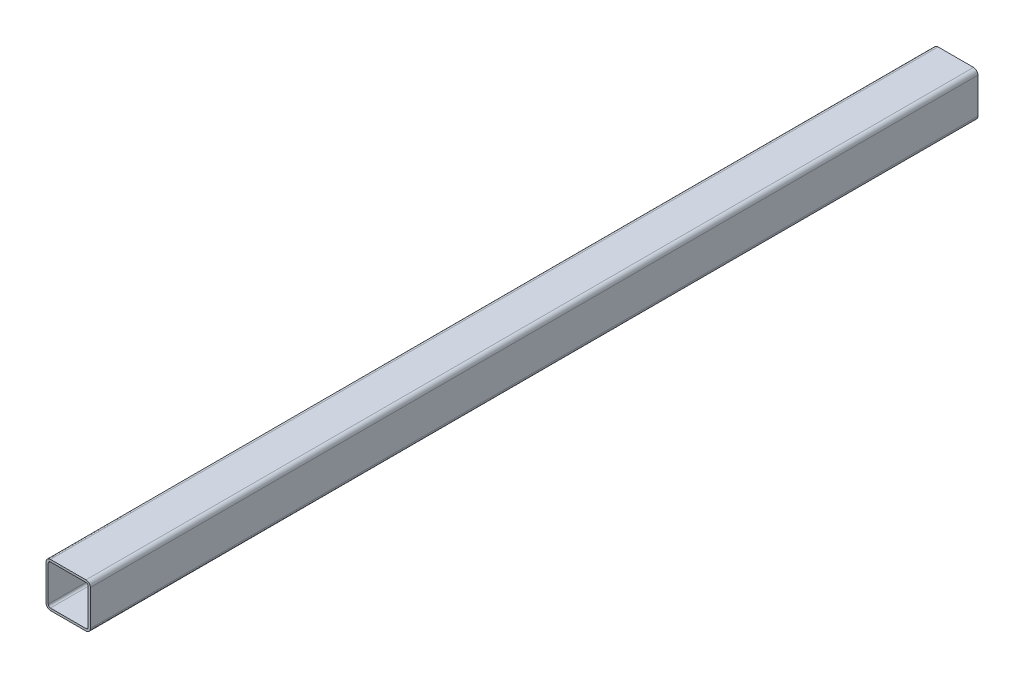
ISO-10303-21;
HEADER;
FILE_DESCRIPTION(('STEP AP214'),'2;1');
FILE_NAME('part.step','',(''),(''),'','','');
FILE_SCHEMA(('AUTOMOTIVE_DESIGN { 1 0 10303 214 1 1 1 1 }'));
ENDSEC;
DATA;
#1=APPLICATION_CONTEXT('core data for automotive mechanical design processes');
#2=APPLICATION_PROTOCOL_DEFINITION('international standard','automotive_design',2000,#1);
#3=PRODUCT_CONTEXT('',#1,'mechanical');
#4=PRODUCT('Part','Part','',(#3));
#5=PRODUCT_RELATED_PRODUCT_CATEGORY('part','',(#4));
#6=PRODUCT_DEFINITION_FORMATION('','',#4);
#7=PRODUCT_DEFINITION_CONTEXT('part definition',#1,'design');
#8=PRODUCT_DEFINITION('design','',#6,#7);
#9=PRODUCT_DEFINITION_SHAPE('','',#8);
#10=(LENGTH_UNIT() NAMED_UNIT(*) SI_UNIT(.MILLI.,.METRE.));
#11=(NAMED_UNIT(*) PLANE_ANGLE_UNIT() SI_UNIT($,.RADIAN.));
#12=(NAMED_UNIT(*) SI_UNIT($,.STERADIAN.) SOLID_ANGLE_UNIT());
#13=UNCERTAINTY_MEASURE_WITH_UNIT(LENGTH_MEASURE(1.E-05),#10,'distance_accuracy_value','');
#14=(GEOMETRIC_REPRESENTATION_CONTEXT(3) GLOBAL_UNCERTAINTY_ASSIGNED_CONTEXT((#13)) GLOBAL_UNIT_ASSIGNED_CONTEXT((#10,
#11,#12)) REPRESENTATION_CONTEXT('',''));
#15=CARTESIAN_POINT('',(0.,0.,0.));
#16=DIRECTION('',(0.,0.,1.));
#17=DIRECTION('',(1.,0.,0.));
#18=AXIS2_PLACEMENT_3D('',#15,#16,#17);
#19=CARTESIAN_POINT('',(-40.,-40.,2000.));
#20=DIRECTION('',(0.,0.,-1.));
#21=DIRECTION('',(-1.,0.,0.));
#22=AXIS2_PLACEMENT_3D('',#19,#20,#21);
#23=CYLINDRICAL_SURFACE('',#22,10.);
#24=CARTESIAN_POINT('',(-40.,-40.,0.));
#25=DIRECTION('',(0.,0.,1.));
#26=DIRECTION('',(1.,0.,0.));
#27=AXIS2_PLACEMENT_3D('',#24,#25,#26);
#28=CIRCLE('',#27,10.);
#29=CARTESIAN_POINT('',(-50.,-40.,0.));
#30=VERTEX_POINT('',#29);
#31=CARTESIAN_POINT('',(-40.,-50.,0.));
#32=VERTEX_POINT('',#31);
#33=EDGE_CURVE('E245',#30,#32,#28,.T.);
#34=ORIENTED_EDGE('',*,*,#33,.T.);
#35=DIRECTION('',(0.,0.,-1.));
#36=VECTOR('',#35,1.);
#37=CARTESIAN_POINT('',(-40.,-50.,2000.));
#38=LINE('',#37,#36);
#39=CARTESIAN_POINT('',(-40.,-50.,2000.));
#40=VERTEX_POINT('',#39);
#41=EDGE_CURVE('E12',#40,#32,#38,.T.);
#42=ORIENTED_EDGE('',*,*,#41,.F.);
#43=CARTESIAN_POINT('',(-40.,-40.,2000.));
#44=DIRECTION('',(0.,0.,1.));
#45=DIRECTION('',(1.,0.,0.));
#46=AXIS2_PLACEMENT_3D('',#43,#44,#45);
#47=CIRCLE('',#46,10.);
#48=CARTESIAN_POINT('',(-50.,-40.,2000.));
#49=VERTEX_POINT('',#48);
#50=EDGE_CURVE('E321',#49,#40,#47,.T.);
#51=ORIENTED_EDGE('',*,*,#50,.F.);
#52=DIRECTION('',(0.,0.,-1.));
#53=VECTOR('',#52,1.);
#54=CARTESIAN_POINT('',(-50.,-40.,2000.));
#55=LINE('',#54,#53);
#56=EDGE_CURVE('E256',#49,#30,#55,.T.);
#57=ORIENTED_EDGE('',*,*,#56,.T.);
#58=EDGE_LOOP('',(#34,#42,#51,#57));
#59=FACE_BOUND('',#58,.T.);
#60=ADVANCED_FACE('F72',(#59),#23,.T.);
#61=CARTESIAN_POINT('',(-40.,-50.,2000.));
#62=DIRECTION('',(0.,1.,0.));
#63=DIRECTION('',(0.,0.,1.));
#64=AXIS2_PLACEMENT_3D('',#61,#62,#63);
#65=PLANE('',#64);
#66=DIRECTION('',(1.,0.,0.));
#67=VECTOR('',#66,1.);
#68=CARTESIAN_POINT('',(-40.,-50.,0.));
#69=LINE('',#68,#67);
#70=CARTESIAN_POINT('',(40.,-50.,0.));
#71=VERTEX_POINT('',#70);
#72=EDGE_CURVE('E247',#32,#71,#69,.T.);
#73=ORIENTED_EDGE('',*,*,#72,.T.);
#74=DIRECTION('',(0.,0.,-1.));
#75=VECTOR('',#74,1.);
#76=CARTESIAN_POINT('',(40.,-50.,2000.));
#77=LINE('',#76,#75);
#78=CARTESIAN_POINT('',(40.,-50.,2000.));
#79=VERTEX_POINT('',#78);
#80=EDGE_CURVE('E83',#79,#71,#77,.T.);
#81=ORIENTED_EDGE('',*,*,#80,.F.);
#82=DIRECTION('',(1.,0.,0.));
#83=VECTOR('',#82,1.);
#84=CARTESIAN_POINT('',(-40.,-50.,2000.));
#85=LINE('',#84,#83);
#86=EDGE_CURVE('E322',#40,#79,#85,.T.);
#87=ORIENTED_EDGE('',*,*,#86,.F.);
#88=ORIENTED_EDGE('',*,*,#41,.T.);
#89=EDGE_LOOP('',(#73,#81,#87,#88));
#90=FACE_BOUND('',#89,.T.);
#91=ADVANCED_FACE('F358',(#90),#65,.F.);
#92=CARTESIAN_POINT('',(40.,-40.,2000.));
#93=DIRECTION('',(0.,0.,-1.));
#94=DIRECTION('',(-1.,0.,0.));
#95=AXIS2_PLACEMENT_3D('',#92,#93,#94);
#96=CYLINDRICAL_SURFACE('',#95,10.);
#97=CARTESIAN_POINT('',(40.,-40.,0.));
#98=DIRECTION('',(0.,0.,1.));
#99=DIRECTION('',(1.,0.,0.));
#100=AXIS2_PLACEMENT_3D('',#97,#98,#99);
#101=CIRCLE('',#100,10.);
#102=CARTESIAN_POINT('',(50.,-40.,0.));
#103=VERTEX_POINT('',#102);
#104=EDGE_CURVE('E246',#71,#103,#101,.T.);
#105=ORIENTED_EDGE('',*,*,#104,.T.);
#106=DIRECTION('',(0.,0.,-1.));
#107=VECTOR('',#106,1.);
#108=CARTESIAN_POINT('',(50.,-40.,2000.));
#109=LINE('',#108,#107);
#110=CARTESIAN_POINT('',(50.,-40.,2000.));
#111=VERTEX_POINT('',#110);
#112=EDGE_CURVE('E262',#111,#103,#109,.T.);
#113=ORIENTED_EDGE('',*,*,#112,.F.);
#114=CARTESIAN_POINT('',(40.,-40.,2000.));
#115=DIRECTION('',(0.,0.,1.));
#116=DIRECTION('',(1.,0.,0.));
#117=AXIS2_PLACEMENT_3D('',#114,#115,#116);
#118=CIRCLE('',#117,10.);
#119=EDGE_CURVE('E324',#79,#111,#118,.T.);
#120=ORIENTED_EDGE('',*,*,#119,.F.);
#121=ORIENTED_EDGE('',*,*,#80,.T.);
#122=EDGE_LOOP('',(#105,#113,#120,#121));
#123=FACE_BOUND('',#122,.T.);
#124=ADVANCED_FACE('F363',(#123),#96,.T.);
#125=CARTESIAN_POINT('',(50.,-40.,2000.));
#126=DIRECTION('',(-1.,0.,0.));
#127=DIRECTION('',(0.,0.,1.));
#128=AXIS2_PLACEMENT_3D('',#125,#126,#127);
#129=PLANE('',#128);
#130=DIRECTION('',(0.,1.,0.));
#131=VECTOR('',#130,1.);
#132=CARTESIAN_POINT('',(50.,-40.,0.));
#133=LINE('',#132,#131);
#134=CARTESIAN_POINT('',(50.,40.,0.));
#135=VERTEX_POINT('',#134);
#136=EDGE_CURVE('E248',#103,#135,#133,.T.);
#137=ORIENTED_EDGE('',*,*,#136,.T.);
#138=DIRECTION('',(0.,0.,-1.));
#139=VECTOR('',#138,1.);
#140=CARTESIAN_POINT('',(50.,40.,2000.));
#141=LINE('',#140,#139);
#142=CARTESIAN_POINT('',(50.,40.,2000.));
#143=VERTEX_POINT('',#142);
#144=EDGE_CURVE('E265',#143,#135,#141,.T.);
#145=ORIENTED_EDGE('',*,*,#144,.F.);
#146=DIRECTION('',(0.,1.,0.));
#147=VECTOR('',#146,1.);
#148=CARTESIAN_POINT('',(50.,-40.,2000.));
#149=LINE('',#148,#147);
#150=EDGE_CURVE('E330',#111,#143,#149,.T.);
#151=ORIENTED_EDGE('',*,*,#150,.F.);
#152=ORIENTED_EDGE('',*,*,#112,.T.);
#153=EDGE_LOOP('',(#137,#145,#151,#152));
#154=FACE_BOUND('',#153,.T.);
#155=ADVANCED_FACE('F335',(#154),#129,.F.);
#156=CARTESIAN_POINT('',(40.,40.,2000.));
#157=DIRECTION('',(0.,0.,-1.));
#158=DIRECTION('',(-1.,0.,0.));
#159=AXIS2_PLACEMENT_3D('',#156,#157,#158);
#160=CYLINDRICAL_SURFACE('',#159,10.);
#161=CARTESIAN_POINT('',(40.,40.,0.));
#162=DIRECTION('',(0.,0.,1.));
#163=DIRECTION('',(1.,0.,0.));
#164=AXIS2_PLACEMENT_3D('',#161,#162,#163);
#165=CIRCLE('',#164,10.);
#166=CARTESIAN_POINT('',(40.,50.,0.));
#167=VERTEX_POINT('',#166);
#168=EDGE_CURVE('E254',#135,#167,#165,.T.);
#169=ORIENTED_EDGE('',*,*,#168,.T.);
#170=DIRECTION('',(0.,0.,-1.));
#171=VECTOR('',#170,1.);
#172=CARTESIAN_POINT('',(40.,50.,2000.));
#173=LINE('',#172,#171);
#174=CARTESIAN_POINT('',(40.,50.,2000.));
#175=VERTEX_POINT('',#174);
#176=EDGE_CURVE('E208',#175,#167,#173,.T.);
#177=ORIENTED_EDGE('',*,*,#176,.F.);
#178=CARTESIAN_POINT('',(40.,40.,2000.));
#179=DIRECTION('',(0.,0.,1.));
#180=DIRECTION('',(1.,0.,0.));
#181=AXIS2_PLACEMENT_3D('',#178,#179,#180);
#182=CIRCLE('',#181,10.);
#183=EDGE_CURVE('E202',#143,#175,#182,.T.);
#184=ORIENTED_EDGE('',*,*,#183,.F.);
#185=ORIENTED_EDGE('',*,*,#144,.T.);
#186=EDGE_LOOP('',(#169,#177,#184,#185));
#187=FACE_BOUND('',#186,.T.);
#188=ADVANCED_FACE('F340',(#187),#160,.T.);
#189=CARTESIAN_POINT('',(40.,50.,2000.));
#190=DIRECTION('',(0.,-1.,0.));
#191=DIRECTION('',(0.,0.,-1.));
#192=AXIS2_PLACEMENT_3D('',#189,#190,#191);
#193=PLANE('',#192);
#194=DIRECTION('',(-1.,0.,0.));
#195=VECTOR('',#194,1.);
#196=CARTESIAN_POINT('',(40.,50.,0.));
#197=LINE('',#196,#195);
#198=CARTESIAN_POINT('',(-40.,50.,0.));
#199=VERTEX_POINT('',#198);
#200=EDGE_CURVE('E206',#167,#199,#197,.T.);
#201=ORIENTED_EDGE('',*,*,#200,.T.);
#202=DIRECTION('',(0.,0.,-1.));
#203=VECTOR('',#202,1.);
#204=CARTESIAN_POINT('',(-40.,50.,2000.));
#205=LINE('',#204,#203);
#206=CARTESIAN_POINT('',(-40.,50.,2000.));
#207=VERTEX_POINT('',#206);
#208=EDGE_CURVE('E207',#207,#199,#205,.T.);
#209=ORIENTED_EDGE('',*,*,#208,.F.);
#210=DIRECTION('',(-1.,0.,0.));
#211=VECTOR('',#210,1.);
#212=CARTESIAN_POINT('',(40.,50.,2000.));
#213=LINE('',#212,#211);
#214=EDGE_CURVE('E193',#175,#207,#213,.T.);
#215=ORIENTED_EDGE('',*,*,#214,.F.);
#216=ORIENTED_EDGE('',*,*,#176,.T.);
#217=EDGE_LOOP('',(#201,#209,#215,#216));
#218=FACE_BOUND('',#217,.T.);
#219=ADVANCED_FACE('F209',(#218),#193,.F.);
#220=CARTESIAN_POINT('',(-40.,40.,2000.));
#221=DIRECTION('',(0.,0.,-1.));
#222=DIRECTION('',(-1.,0.,0.));
#223=AXIS2_PLACEMENT_3D('',#220,#221,#222);
#224=CYLINDRICAL_SURFACE('',#223,10.);
#225=CARTESIAN_POINT('',(-40.,40.,0.));
#226=DIRECTION('',(0.,0.,1.));
#227=DIRECTION('',(1.,0.,0.));
#228=AXIS2_PLACEMENT_3D('',#225,#226,#227);
#229=CIRCLE('',#228,10.);
#230=CARTESIAN_POINT('',(-50.,40.,0.));
#231=VERTEX_POINT('',#230);
#232=EDGE_CURVE('E142',#199,#231,#229,.T.);
#233=ORIENTED_EDGE('',*,*,#232,.T.);
#234=DIRECTION('',(0.,0.,-1.));
#235=VECTOR('',#234,1.);
#236=CARTESIAN_POINT('',(-50.,40.,2000.));
#237=LINE('',#236,#235);
#238=CARTESIAN_POINT('',(-50.,40.,2000.));
#239=VERTEX_POINT('',#238);
#240=EDGE_CURVE('E213',#239,#231,#237,.T.);
#241=ORIENTED_EDGE('',*,*,#240,.F.);
#242=CARTESIAN_POINT('',(-40.,40.,2000.));
#243=DIRECTION('',(0.,0.,1.));
#244=DIRECTION('',(1.,0.,0.));
#245=AXIS2_PLACEMENT_3D('',#242,#243,#244);
#246=CIRCLE('',#245,10.);
#247=EDGE_CURVE('E196',#207,#239,#246,.T.);
#248=ORIENTED_EDGE('',*,*,#247,.F.);
#249=ORIENTED_EDGE('',*,*,#208,.T.);
#250=EDGE_LOOP('',(#233,#241,#248,#249));
#251=FACE_BOUND('',#250,.T.);
#252=ADVANCED_FACE('F211',(#251),#224,.T.);
#253=CARTESIAN_POINT('',(-40.,-40.,2000.));
#254=DIRECTION('',(0.,0.,-1.));
#255=DIRECTION('',(-1.,0.,0.));
#256=AXIS2_PLACEMENT_3D('',#253,#254,#255);
#257=CYLINDRICAL_SURFACE('',#256,5.);
#258=CARTESIAN_POINT('',(-40.,-40.,0.));
#259=DIRECTION('',(0.,0.,1.));
#260=DIRECTION('',(1.,0.,0.));
#261=AXIS2_PLACEMENT_3D('',#258,#259,#260);
#262=CIRCLE('',#261,5.);
#263=CARTESIAN_POINT('',(-45.,-40.,0.));
#264=VERTEX_POINT('',#263);
#265=CARTESIAN_POINT('',(-40.,-45.,0.));
#266=VERTEX_POINT('',#265);
#267=EDGE_CURVE('E219',#264,#266,#262,.T.);
#268=ORIENTED_EDGE('',*,*,#267,.F.);
#269=DIRECTION('',(0.,0.,-1.));
#270=VECTOR('',#269,1.);
#271=CARTESIAN_POINT('',(-45.,-40.,2000.));
#272=LINE('',#271,#270);
#273=CARTESIAN_POINT('',(-45.,-40.,2000.));
#274=VERTEX_POINT('',#273);
#275=EDGE_CURVE('E73',#274,#264,#272,.T.);
#276=ORIENTED_EDGE('',*,*,#275,.F.);
#277=CARTESIAN_POINT('',(-40.,-40.,2000.));
#278=DIRECTION('',(0.,0.,1.));
#279=DIRECTION('',(1.,0.,0.));
#280=AXIS2_PLACEMENT_3D('',#277,#278,#279);
#281=CIRCLE('',#280,5.);
#282=CARTESIAN_POINT('',(-40.,-45.,2000.));
#283=VERTEX_POINT('',#282);
#284=EDGE_CURVE('E257',#274,#283,#281,.T.);
#285=ORIENTED_EDGE('',*,*,#284,.T.);
#286=DIRECTION('',(0.,0.,-1.));
#287=VECTOR('',#286,1.);
#288=CARTESIAN_POINT('',(-40.,-45.,2000.));
#289=LINE('',#288,#287);
#290=EDGE_CURVE('E214',#283,#266,#289,.T.);
#291=ORIENTED_EDGE('',*,*,#290,.T.);
#292=EDGE_LOOP('',(#268,#276,#285,#291));
#293=FACE_BOUND('',#292,.T.);
#294=ADVANCED_FACE('F75',(#293),#257,.F.);
#295=CARTESIAN_POINT('',(-45.,40.,2000.));
#296=DIRECTION('',(1.,0.,0.));
#297=DIRECTION('',(0.,0.,-1.));
#298=AXIS2_PLACEMENT_3D('',#295,#296,#297);
#299=PLANE('',#298);
#300=DIRECTION('',(0.,-1.,0.));
#301=VECTOR('',#300,1.);
#302=CARTESIAN_POINT('',(-45.,40.,0.));
#303=LINE('',#302,#301);
#304=CARTESIAN_POINT('',(-45.,40.,0.));
#305=VERTEX_POINT('',#304);
#306=EDGE_CURVE('E225',#305,#264,#303,.T.);
#307=ORIENTED_EDGE('',*,*,#306,.F.);
#308=DIRECTION('',(0.,0.,-1.));
#309=VECTOR('',#308,1.);
#310=CARTESIAN_POINT('',(-45.,40.,2000.));
#311=LINE('',#310,#309);
#312=CARTESIAN_POINT('',(-45.,40.,2000.));
#313=VERTEX_POINT('',#312);
#314=EDGE_CURVE('E279',#313,#305,#311,.T.);
#315=ORIENTED_EDGE('',*,*,#314,.F.);
#316=DIRECTION('',(0.,-1.,0.));
#317=VECTOR('',#316,1.);
#318=CARTESIAN_POINT('',(-45.,40.,2000.));
#319=LINE('',#318,#317);
#320=EDGE_CURVE('E286',#313,#274,#319,.T.);
#321=ORIENTED_EDGE('',*,*,#320,.T.);
#322=ORIENTED_EDGE('',*,*,#275,.T.);
#323=EDGE_LOOP('',(#307,#315,#321,#322));
#324=FACE_BOUND('',#323,.T.);
#325=ADVANCED_FACE('F289',(#324),#299,.T.);
#326=CARTESIAN_POINT('',(-40.,40.,2000.));
#327=DIRECTION('',(0.,0.,-1.));
#328=DIRECTION('',(-1.,0.,0.));
#329=AXIS2_PLACEMENT_3D('',#326,#327,#328);
#330=CYLINDRICAL_SURFACE('',#329,5.);
#331=CARTESIAN_POINT('',(-40.,40.,0.));
#332=DIRECTION('',(0.,0.,1.));
#333=DIRECTION('',(1.,0.,0.));
#334=AXIS2_PLACEMENT_3D('',#331,#332,#333);
#335=CIRCLE('',#334,5.);
#336=CARTESIAN_POINT('',(-40.,45.,0.));
#337=VERTEX_POINT('',#336);
#338=EDGE_CURVE('E224',#337,#305,#335,.T.);
#339=ORIENTED_EDGE('',*,*,#338,.F.);
#340=DIRECTION('',(0.,0.,-1.));
#341=VECTOR('',#340,1.);
#342=CARTESIAN_POINT('',(-40.,45.,2000.));
#343=LINE('',#342,#341);
#344=CARTESIAN_POINT('',(-40.,45.,2000.));
#345=VERTEX_POINT('',#344);
#346=EDGE_CURVE('E278',#345,#337,#343,.T.);
#347=ORIENTED_EDGE('',*,*,#346,.F.);
#348=CARTESIAN_POINT('',(-40.,40.,2000.));
#349=DIRECTION('',(0.,0.,1.));
#350=DIRECTION('',(1.,0.,0.));
#351=AXIS2_PLACEMENT_3D('',#348,#349,#350);
#352=CIRCLE('',#351,5.);
#353=EDGE_CURVE('E299',#345,#313,#352,.T.);
#354=ORIENTED_EDGE('',*,*,#353,.T.);
#355=ORIENTED_EDGE('',*,*,#314,.T.);
#356=EDGE_LOOP('',(#339,#347,#354,#355));
#357=FACE_BOUND('',#356,.T.);
#358=ADVANCED_FACE('F293',(#357),#330,.F.);
#359=CARTESIAN_POINT('',(40.,45.,2000.));
#360=DIRECTION('',(0.,-1.,0.));
#361=DIRECTION('',(0.,0.,-1.));
#362=AXIS2_PLACEMENT_3D('',#359,#360,#361);
#363=PLANE('',#362);
#364=DIRECTION('',(-1.,0.,0.));
#365=VECTOR('',#364,1.);
#366=CARTESIAN_POINT('',(40.,45.,0.));
#367=LINE('',#366,#365);
#368=CARTESIAN_POINT('',(40.,45.,0.));
#369=VERTEX_POINT('',#368);
#370=EDGE_CURVE('E228',#369,#337,#367,.T.);
#371=ORIENTED_EDGE('',*,*,#370,.F.);
#372=DIRECTION('',(0.,0.,-1.));
#373=VECTOR('',#372,1.);
#374=CARTESIAN_POINT('',(40.,45.,2000.));
#375=LINE('',#374,#373);
#376=CARTESIAN_POINT('',(40.,45.,2000.));
#377=VERTEX_POINT('',#376);
#378=EDGE_CURVE('E280',#377,#369,#375,.T.);
#379=ORIENTED_EDGE('',*,*,#378,.F.);
#380=DIRECTION('',(-1.,0.,0.));
#381=VECTOR('',#380,1.);
#382=CARTESIAN_POINT('',(40.,45.,2000.));
#383=LINE('',#382,#381);
#384=EDGE_CURVE('E301',#377,#345,#383,.T.);
#385=ORIENTED_EDGE('',*,*,#384,.T.);
#386=ORIENTED_EDGE('',*,*,#346,.T.);
#387=EDGE_LOOP('',(#371,#379,#385,#386));
#388=FACE_BOUND('',#387,.T.);
#389=ADVANCED_FACE('F308',(#388),#363,.T.);
#390=CARTESIAN_POINT('',(40.,40.,2000.));
#391=DIRECTION('',(0.,0.,-1.));
#392=DIRECTION('',(-1.,0.,0.));
#393=AXIS2_PLACEMENT_3D('',#390,#391,#392);
#394=CYLINDRICAL_SURFACE('',#393,5.);
#395=CARTESIAN_POINT('',(40.,40.,0.));
#396=DIRECTION('',(0.,0.,1.));
#397=DIRECTION('',(1.,0.,0.));
#398=AXIS2_PLACEMENT_3D('',#395,#396,#397);
#399=CIRCLE('',#398,5.);
#400=CARTESIAN_POINT('',(45.,40.,0.));
#401=VERTEX_POINT('',#400);
#402=EDGE_CURVE('E231',#401,#369,#399,.T.);
#403=ORIENTED_EDGE('',*,*,#402,.F.);
#404=DIRECTION('',(0.,0.,-1.));
#405=VECTOR('',#404,1.);
#406=CARTESIAN_POINT('',(45.,40.,2000.));
#407=LINE('',#406,#405);
#408=CARTESIAN_POINT('',(45.,40.,2000.));
#409=VERTEX_POINT('',#408);
#410=EDGE_CURVE('E274',#409,#401,#407,.T.);
#411=ORIENTED_EDGE('',*,*,#410,.F.);
#412=CARTESIAN_POINT('',(40.,40.,2000.));
#413=DIRECTION('',(0.,0.,1.));
#414=DIRECTION('',(1.,0.,0.));
#415=AXIS2_PLACEMENT_3D('',#412,#413,#414);
#416=CIRCLE('',#415,5.);
#417=EDGE_CURVE('E310',#409,#377,#416,.T.);
#418=ORIENTED_EDGE('',*,*,#417,.T.);
#419=ORIENTED_EDGE('',*,*,#378,.T.);
#420=EDGE_LOOP('',(#403,#411,#418,#419));
#421=FACE_BOUND('',#420,.T.);
#422=ADVANCED_FACE('F371',(#421),#394,.F.);
#423=CARTESIAN_POINT('',(45.,-40.,2000.));
#424=DIRECTION('',(-1.,0.,0.));
#425=DIRECTION('',(0.,0.,1.));
#426=AXIS2_PLACEMENT_3D('',#423,#424,#425);
#427=PLANE('',#426);
#428=DIRECTION('',(0.,1.,0.));
#429=VECTOR('',#428,1.);
#430=CARTESIAN_POINT('',(45.,-40.,0.));
#431=LINE('',#430,#429);
#432=CARTESIAN_POINT('',(45.,-40.,0.));
#433=VERTEX_POINT('',#432);
#434=EDGE_CURVE('E233',#433,#401,#431,.T.);
#435=ORIENTED_EDGE('',*,*,#434,.F.);
#436=DIRECTION('',(0.,0.,-1.));
#437=VECTOR('',#436,1.);
#438=CARTESIAN_POINT('',(45.,-40.,2000.));
#439=LINE('',#438,#437);
#440=CARTESIAN_POINT('',(45.,-40.,2000.));
#441=VERTEX_POINT('',#440);
#442=EDGE_CURVE('E273',#441,#433,#439,.T.);
#443=ORIENTED_EDGE('',*,*,#442,.F.);
#444=DIRECTION('',(0.,1.,0.));
#445=VECTOR('',#444,1.);
#446=CARTESIAN_POINT('',(45.,-40.,2000.));
#447=LINE('',#446,#445);
#448=EDGE_CURVE('E309',#441,#409,#447,.T.);
#449=ORIENTED_EDGE('',*,*,#448,.T.);
#450=ORIENTED_EDGE('',*,*,#410,.T.);
#451=EDGE_LOOP('',(#435,#443,#449,#450));
#452=FACE_BOUND('',#451,.T.);
#453=ADVANCED_FACE('F369',(#452),#427,.T.);
#454=CARTESIAN_POINT('',(40.,-40.,2000.));
#455=DIRECTION('',(0.,0.,-1.));
#456=DIRECTION('',(-1.,0.,0.));
#457=AXIS2_PLACEMENT_3D('',#454,#455,#456);
#458=CYLINDRICAL_SURFACE('',#457,5.);
#459=CARTESIAN_POINT('',(40.,-40.,0.));
#460=DIRECTION('',(0.,0.,1.));
#461=DIRECTION('',(1.,0.,0.));
#462=AXIS2_PLACEMENT_3D('',#459,#460,#461);
#463=CIRCLE('',#462,5.);
#464=CARTESIAN_POINT('',(40.,-45.,0.));
#465=VERTEX_POINT('',#464);
#466=EDGE_CURVE('E240',#465,#433,#463,.T.);
#467=ORIENTED_EDGE('',*,*,#466,.F.);
#468=DIRECTION('',(0.,0.,-1.));
#469=VECTOR('',#468,1.);
#470=CARTESIAN_POINT('',(40.,-45.,2000.));
#471=LINE('',#470,#469);
#472=CARTESIAN_POINT('',(40.,-45.,2000.));
#473=VERTEX_POINT('',#472);
#474=EDGE_CURVE('E271',#473,#465,#471,.T.);
#475=ORIENTED_EDGE('',*,*,#474,.F.);
#476=CARTESIAN_POINT('',(40.,-40.,2000.));
#477=DIRECTION('',(0.,0.,1.));
#478=DIRECTION('',(1.,0.,0.));
#479=AXIS2_PLACEMENT_3D('',#476,#477,#478);
#480=CIRCLE('',#479,5.);
#481=EDGE_CURVE('E314',#473,#441,#480,.T.);
#482=ORIENTED_EDGE('',*,*,#481,.T.);
#483=ORIENTED_EDGE('',*,*,#442,.T.);
#484=EDGE_LOOP('',(#467,#475,#482,#483));
#485=FACE_BOUND('',#484,.T.);
#486=ADVANCED_FACE('F355',(#485),#458,.F.);
#487=CARTESIAN_POINT('',(-40.,-45.,2000.));
#488=DIRECTION('',(0.,1.,0.));
#489=DIRECTION('',(0.,0.,1.));
#490=AXIS2_PLACEMENT_3D('',#487,#488,#489);
#491=PLANE('',#490);
#492=DIRECTION('',(1.,0.,0.));
#493=VECTOR('',#492,1.);
#494=CARTESIAN_POINT('',(-40.,-45.,0.));
#495=LINE('',#494,#493);
#496=EDGE_CURVE('E238',#266,#465,#495,.T.);
#497=ORIENTED_EDGE('',*,*,#496,.F.);
#498=ORIENTED_EDGE('',*,*,#290,.F.);
#499=DIRECTION('',(1.,0.,0.));
#500=VECTOR('',#499,1.);
#501=CARTESIAN_POINT('',(-40.,-45.,2000.));
#502=LINE('',#501,#500);
#503=EDGE_CURVE('E318',#283,#473,#502,.T.);
#504=ORIENTED_EDGE('',*,*,#503,.T.);
#505=ORIENTED_EDGE('',*,*,#474,.T.);
#506=EDGE_LOOP('',(#497,#498,#504,#505));
#507=FACE_BOUND('',#506,.T.);
#508=ADVANCED_FACE('F343',(#507),#491,.T.);
#509=CARTESIAN_POINT('',(-50.,40.,2000.));
#510=DIRECTION('',(1.,0.,0.));
#511=DIRECTION('',(0.,0.,-1.));
#512=AXIS2_PLACEMENT_3D('',#509,#510,#511);
#513=PLANE('',#512);
#514=DIRECTION('',(0.,-1.,0.));
#515=VECTOR('',#514,1.);
#516=CARTESIAN_POINT('',(-50.,40.,0.));
#517=LINE('',#516,#515);
#518=EDGE_CURVE('E146',#231,#30,#517,.T.);
#519=ORIENTED_EDGE('',*,*,#518,.T.);
#520=ORIENTED_EDGE('',*,*,#56,.F.);
#521=DIRECTION('',(0.,-1.,0.));
#522=VECTOR('',#521,1.);
#523=CARTESIAN_POINT('',(-50.,40.,2000.));
#524=LINE('',#523,#522);
#525=EDGE_CURVE('E89',#239,#49,#524,.T.);
#526=ORIENTED_EDGE('',*,*,#525,.F.);
#527=ORIENTED_EDGE('',*,*,#240,.T.);
#528=EDGE_LOOP('',(#519,#520,#526,#527));
#529=FACE_BOUND('',#528,.T.);
#530=ADVANCED_FACE('F345',(#529),#513,.F.);
#531=CARTESIAN_POINT('',(-40.,-40.,2000.));
#532=DIRECTION('',(0.,0.,1.));
#533=DIRECTION('',(1.,0.,0.));
#534=AXIS2_PLACEMENT_3D('',#531,#532,#533);
#535=PLANE('',#534);
#536=ORIENTED_EDGE('',*,*,#284,.F.);
#537=ORIENTED_EDGE('',*,*,#320,.F.);
#538=ORIENTED_EDGE('',*,*,#353,.F.);
#539=ORIENTED_EDGE('',*,*,#384,.F.);
#540=ORIENTED_EDGE('',*,*,#417,.F.);
#541=ORIENTED_EDGE('',*,*,#448,.F.);
#542=ORIENTED_EDGE('',*,*,#481,.F.);
#543=ORIENTED_EDGE('',*,*,#503,.F.);
#544=EDGE_LOOP('',(#536,#537,#538,#539,#540,#541,#542,#543));
#545=FACE_BOUND('',#544,.T.);
#546=ORIENTED_EDGE('',*,*,#50,.T.);
#547=ORIENTED_EDGE('',*,*,#86,.T.);
#548=ORIENTED_EDGE('',*,*,#119,.T.);
#549=ORIENTED_EDGE('',*,*,#150,.T.);
#550=ORIENTED_EDGE('',*,*,#183,.T.);
#551=ORIENTED_EDGE('',*,*,#214,.T.);
#552=ORIENTED_EDGE('',*,*,#247,.T.);
#553=ORIENTED_EDGE('',*,*,#525,.T.);
#554=EDGE_LOOP('',(#546,#547,#548,#549,#550,#551,#552,#553));
#555=FACE_BOUND('',#554,.T.);
#556=ADVANCED_FACE('F199',(#545,#555),#535,.T.);
#557=CARTESIAN_POINT('',(-40.,-40.,0.));
#558=DIRECTION('',(0.,0.,1.));
#559=DIRECTION('',(1.,0.,0.));
#560=AXIS2_PLACEMENT_3D('',#557,#558,#559);
#561=PLANE('',#560);
#562=ORIENTED_EDGE('',*,*,#267,.T.);
#563=ORIENTED_EDGE('',*,*,#496,.T.);
#564=ORIENTED_EDGE('',*,*,#466,.T.);
#565=ORIENTED_EDGE('',*,*,#434,.T.);
#566=ORIENTED_EDGE('',*,*,#402,.T.);
#567=ORIENTED_EDGE('',*,*,#370,.T.);
#568=ORIENTED_EDGE('',*,*,#338,.T.);
#569=ORIENTED_EDGE('',*,*,#306,.T.);
#570=EDGE_LOOP('',(#562,#563,#564,#565,#566,#567,#568,#569));
#571=FACE_BOUND('',#570,.T.);
#572=ORIENTED_EDGE('',*,*,#33,.F.);
#573=ORIENTED_EDGE('',*,*,#518,.F.);
#574=ORIENTED_EDGE('',*,*,#232,.F.);
#575=ORIENTED_EDGE('',*,*,#200,.F.);
#576=ORIENTED_EDGE('',*,*,#168,.F.);
#577=ORIENTED_EDGE('',*,*,#136,.F.);
#578=ORIENTED_EDGE('',*,*,#104,.F.);
#579=ORIENTED_EDGE('',*,*,#72,.F.);
#580=EDGE_LOOP('',(#572,#573,#574,#575,#576,#577,#578,#579));
#581=FACE_BOUND('',#580,.T.);
#582=ADVANCED_FACE('F295',(#571,#581),#561,.F.);
#583=CLOSED_SHELL('',(#60,#91,#124,#155,#188,#219,#252,#294,#325,#358,#389,#422,#453,#486,#508,
#530,#556,#582));
#584=MANIFOLD_SOLID_BREP('B2',#583);
#585=ADVANCED_BREP_SHAPE_REPRESENTATION('',(#18,#584),#14);
#586=SHAPE_DEFINITION_REPRESENTATION(#9,#585);
ENDSEC;
END-ISO-10303-21;
